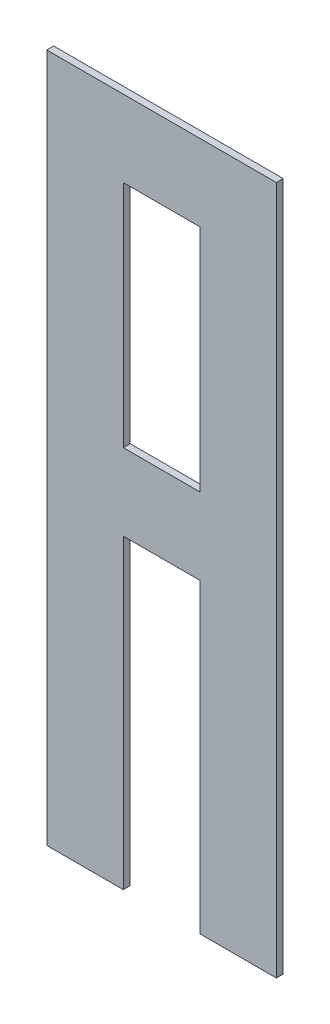
ISO-10303-21;
HEADER;
FILE_DESCRIPTION(('STEP AP214'),'2;1');
FILE_NAME('part.step','',(''),(''),'','','');
FILE_SCHEMA(('AUTOMOTIVE_DESIGN { 1 0 10303 214 1 1 1 1 }'));
ENDSEC;
DATA;
#1=APPLICATION_CONTEXT('core data for automotive mechanical design processes');
#2=APPLICATION_PROTOCOL_DEFINITION('international standard','automotive_design',2000,#1);
#3=PRODUCT_CONTEXT('',#1,'mechanical');
#4=PRODUCT('Part','Part','',(#3));
#5=PRODUCT_RELATED_PRODUCT_CATEGORY('part','',(#4));
#6=PRODUCT_DEFINITION_FORMATION('','',#4);
#7=PRODUCT_DEFINITION_CONTEXT('part definition',#1,'design');
#8=PRODUCT_DEFINITION('design','',#6,#7);
#9=PRODUCT_DEFINITION_SHAPE('','',#8);
#10=(LENGTH_UNIT() NAMED_UNIT(*) SI_UNIT(.MILLI.,.METRE.));
#11=(NAMED_UNIT(*) PLANE_ANGLE_UNIT() SI_UNIT($,.RADIAN.));
#12=(NAMED_UNIT(*) SI_UNIT($,.STERADIAN.) SOLID_ANGLE_UNIT());
#13=UNCERTAINTY_MEASURE_WITH_UNIT(LENGTH_MEASURE(1.E-05),#10,'distance_accuracy_value','');
#14=(GEOMETRIC_REPRESENTATION_CONTEXT(3) GLOBAL_UNCERTAINTY_ASSIGNED_CONTEXT((#13)) GLOBAL_UNIT_ASSIGNED_CONTEXT((#10,
#11,#12)) REPRESENTATION_CONTEXT('',''));
#15=CARTESIAN_POINT('',(0.,0.,0.));
#16=DIRECTION('',(0.,0.,1.));
#17=DIRECTION('',(1.,0.,0.));
#18=AXIS2_PLACEMENT_3D('',#15,#16,#17);
#19=CARTESIAN_POINT('',(0.,0.,0.05));
#20=DIRECTION('',(0.,0.,1.));
#21=DIRECTION('',(1.,0.,0.));
#22=AXIS2_PLACEMENT_3D('',#19,#20,#21);
#23=PLANE('',#22);
#24=DIRECTION('',(1.,0.,0.));
#25=VECTOR('',#24,1.);
#26=CARTESIAN_POINT('',(0.,1.944,0.05));
#27=LINE('',#26,#25);
#28=CARTESIAN_POINT('',(-0.278,1.944,0.05));
#29=VERTEX_POINT('',#28);
#30=CARTESIAN_POINT('',(0.278,1.944,0.05));
#31=VERTEX_POINT('',#30);
#32=EDGE_CURVE('E20',#29,#31,#27,.T.);
#33=ORIENTED_EDGE('',*,*,#32,.T.);
#34=DIRECTION('',(0.,1.,0.));
#35=VECTOR('',#34,1.);
#36=CARTESIAN_POINT('',(0.278,1.944,0.05));
#37=LINE('',#36,#35);
#38=CARTESIAN_POINT('',(0.278,0.278,0.05));
#39=VERTEX_POINT('',#38);
#40=EDGE_CURVE('E152',#39,#31,#37,.T.);
#41=ORIENTED_EDGE('',*,*,#40,.F.);
#42=DIRECTION('',(1.,0.,0.));
#43=VECTOR('',#42,1.);
#44=CARTESIAN_POINT('',(0.278,0.278,0.05));
#45=LINE('',#44,#43);
#46=CARTESIAN_POINT('',(-0.278,0.278,0.05));
#47=VERTEX_POINT('',#46);
#48=EDGE_CURVE('E155',#47,#39,#45,.T.);
#49=ORIENTED_EDGE('',*,*,#48,.F.);
#50=DIRECTION('',(0.,1.,0.));
#51=VECTOR('',#50,1.);
#52=CARTESIAN_POINT('',(-0.278,0.278,0.05));
#53=LINE('',#52,#51);
#54=EDGE_CURVE('E159',#29,#47,#53,.F.);
#55=ORIENTED_EDGE('',*,*,#54,.F.);
#56=EDGE_LOOP('',(#33,#41,#49,#55));
#57=FACE_BOUND('',#56,.T.);
#58=DIRECTION('',(0.,1.,0.));
#59=VECTOR('',#58,1.);
#60=CARTESIAN_POINT('',(-0.833,2.5,0.05));
#61=LINE('',#60,#59);
#62=CARTESIAN_POINT('',(-0.833,-2.5,0.05));
#63=VERTEX_POINT('',#62);
#64=CARTESIAN_POINT('',(-0.833,2.5,0.05));
#65=VERTEX_POINT('',#64);
#66=EDGE_CURVE('E120',#63,#65,#61,.T.);
#67=ORIENTED_EDGE('',*,*,#66,.F.);
#68=DIRECTION('',(1.,0.,0.));
#69=VECTOR('',#68,1.);
#70=CARTESIAN_POINT('',(-0.833,-2.5,0.05));
#71=LINE('',#70,#69);
#72=CARTESIAN_POINT('',(-0.278,-2.5,0.05));
#73=VERTEX_POINT('',#72);
#74=EDGE_CURVE('E116',#73,#63,#71,.F.);
#75=ORIENTED_EDGE('',*,*,#74,.F.);
#76=DIRECTION('',(0.,1.,0.));
#77=VECTOR('',#76,1.);
#78=CARTESIAN_POINT('',(-0.278,-2.5,0.05));
#79=LINE('',#78,#77);
#80=CARTESIAN_POINT('',(-0.278,-0.278,0.05));
#81=VERTEX_POINT('',#80);
#82=EDGE_CURVE('E107',#81,#73,#79,.F.);
#83=ORIENTED_EDGE('',*,*,#82,.F.);
#84=DIRECTION('',(1.,0.,0.));
#85=VECTOR('',#84,1.);
#86=CARTESIAN_POINT('',(-0.278,-0.278,0.05));
#87=LINE('',#86,#85);
#88=CARTESIAN_POINT('',(0.278,-0.278,0.05));
#89=VERTEX_POINT('',#88);
#90=EDGE_CURVE('E102',#89,#81,#87,.F.);
#91=ORIENTED_EDGE('',*,*,#90,.F.);
#92=DIRECTION('',(0.,1.,0.));
#93=VECTOR('',#92,1.);
#94=CARTESIAN_POINT('',(0.278,-0.278,0.05));
#95=LINE('',#94,#93);
#96=CARTESIAN_POINT('',(0.278,-2.5,0.05));
#97=VERTEX_POINT('',#96);
#98=EDGE_CURVE('E131',#97,#89,#95,.T.);
#99=ORIENTED_EDGE('',*,*,#98,.F.);
#100=DIRECTION('',(1.,0.,0.));
#101=VECTOR('',#100,1.);
#102=CARTESIAN_POINT('',(0.278,-2.5,0.05));
#103=LINE('',#102,#101);
#104=CARTESIAN_POINT('',(0.833,-2.5,0.05));
#105=VERTEX_POINT('',#104);
#106=EDGE_CURVE('E135',#105,#97,#103,.F.);
#107=ORIENTED_EDGE('',*,*,#106,.F.);
#108=DIRECTION('',(0.,1.,0.));
#109=VECTOR('',#108,1.);
#110=CARTESIAN_POINT('',(0.833,-2.5,0.05));
#111=LINE('',#110,#109);
#112=CARTESIAN_POINT('',(0.833,2.5,0.05));
#113=VERTEX_POINT('',#112);
#114=EDGE_CURVE('E139',#113,#105,#111,.F.);
#115=ORIENTED_EDGE('',*,*,#114,.F.);
#116=DIRECTION('',(1.,0.,0.));
#117=VECTOR('',#116,1.);
#118=CARTESIAN_POINT('',(0.833,2.5,0.05));
#119=LINE('',#118,#117);
#120=EDGE_CURVE('E143',#65,#113,#119,.T.);
#121=ORIENTED_EDGE('',*,*,#120,.F.);
#122=EDGE_LOOP('',(#67,#75,#83,#91,#99,#107,#115,#121));
#123=FACE_BOUND('',#122,.T.);
#124=ADVANCED_FACE('F17',(#57,#123),#23,.T.);
#125=CARTESIAN_POINT('',(-0.833,-2.5,0.));
#126=DIRECTION('',(0.,-1.,0.));
#127=DIRECTION('',(0.,0.,-1.));
#128=AXIS2_PLACEMENT_3D('',#125,#126,#127);
#129=PLANE('',#128);
#130=DIRECTION('',(0.,0.,1.));
#131=VECTOR('',#130,1.);
#132=CARTESIAN_POINT('',(-0.833,-2.5,0.));
#133=LINE('',#132,#131);
#134=CARTESIAN_POINT('',(-0.833,-2.5,0.));
#135=VERTEX_POINT('',#134);
#136=EDGE_CURVE('E147',#135,#63,#133,.T.);
#137=ORIENTED_EDGE('',*,*,#136,.F.);
#138=DIRECTION('',(1.,0.,0.));
#139=VECTOR('',#138,1.);
#140=CARTESIAN_POINT('',(0.,-2.5,0.));
#141=LINE('',#140,#139);
#142=CARTESIAN_POINT('',(-0.278,-2.5,0.));
#143=VERTEX_POINT('',#142);
#144=EDGE_CURVE('E126',#135,#143,#141,.T.);
#145=ORIENTED_EDGE('',*,*,#144,.T.);
#146=DIRECTION('',(0.,0.,-1.));
#147=VECTOR('',#146,1.);
#148=CARTESIAN_POINT('',(-0.278,-2.5,0.));
#149=LINE('',#148,#147);
#150=EDGE_CURVE('E112',#73,#143,#149,.T.);
#151=ORIENTED_EDGE('',*,*,#150,.F.);
#152=ORIENTED_EDGE('',*,*,#74,.T.);
#153=EDGE_LOOP('',(#137,#145,#151,#152));
#154=FACE_BOUND('',#153,.T.);
#155=ADVANCED_FACE('F125',(#154),#129,.T.);
#156=CARTESIAN_POINT('',(-0.278,-2.5,0.));
#157=DIRECTION('',(1.,0.,0.));
#158=DIRECTION('',(0.,0.,-1.));
#159=AXIS2_PLACEMENT_3D('',#156,#157,#158);
#160=PLANE('',#159);
#161=ORIENTED_EDGE('',*,*,#150,.T.);
#162=DIRECTION('',(0.,1.,0.));
#163=VECTOR('',#162,1.);
#164=CARTESIAN_POINT('',(-0.278,0.,0.));
#165=LINE('',#164,#163);
#166=CARTESIAN_POINT('',(-0.278,-0.278,0.));
#167=VERTEX_POINT('',#166);
#168=EDGE_CURVE('E168',#143,#167,#165,.T.);
#169=ORIENTED_EDGE('',*,*,#168,.T.);
#170=DIRECTION('',(0.,0.,-1.));
#171=VECTOR('',#170,1.);
#172=CARTESIAN_POINT('',(-0.278,-0.278,0.));
#173=LINE('',#172,#171);
#174=EDGE_CURVE('E114',#81,#167,#173,.T.);
#175=ORIENTED_EDGE('',*,*,#174,.F.);
#176=ORIENTED_EDGE('',*,*,#82,.T.);
#177=EDGE_LOOP('',(#161,#169,#175,#176));
#178=FACE_BOUND('',#177,.T.);
#179=ADVANCED_FACE('F109',(#178),#160,.T.);
#180=CARTESIAN_POINT('',(-0.278,-0.278,0.));
#181=DIRECTION('',(0.,-1.,0.));
#182=DIRECTION('',(0.,0.,-1.));
#183=AXIS2_PLACEMENT_3D('',#180,#181,#182);
#184=PLANE('',#183);
#185=ORIENTED_EDGE('',*,*,#174,.T.);
#186=DIRECTION('',(1.,0.,0.));
#187=VECTOR('',#186,1.);
#188=CARTESIAN_POINT('',(0.,-0.278,0.));
#189=LINE('',#188,#187);
#190=CARTESIAN_POINT('',(0.278,-0.278,0.));
#191=VERTEX_POINT('',#190);
#192=EDGE_CURVE('E170',#167,#191,#189,.T.);
#193=ORIENTED_EDGE('',*,*,#192,.T.);
#194=DIRECTION('',(0.,0.,1.));
#195=VECTOR('',#194,1.);
#196=CARTESIAN_POINT('',(0.278,-0.278,0.));
#197=LINE('',#196,#195);
#198=EDGE_CURVE('E133',#89,#191,#197,.F.);
#199=ORIENTED_EDGE('',*,*,#198,.F.);
#200=ORIENTED_EDGE('',*,*,#90,.T.);
#201=EDGE_LOOP('',(#185,#193,#199,#200));
#202=FACE_BOUND('',#201,.T.);
#203=ADVANCED_FACE('F245',(#202),#184,.T.);
#204=CARTESIAN_POINT('',(0.278,-0.278,0.));
#205=DIRECTION('',(-1.,0.,0.));
#206=DIRECTION('',(0.,0.,1.));
#207=AXIS2_PLACEMENT_3D('',#204,#205,#206);
#208=PLANE('',#207);
#209=ORIENTED_EDGE('',*,*,#198,.T.);
#210=DIRECTION('',(0.,1.,0.));
#211=VECTOR('',#210,1.);
#212=CARTESIAN_POINT('',(0.278,0.,0.));
#213=LINE('',#212,#211);
#214=CARTESIAN_POINT('',(0.278,-2.5,0.));
#215=VERTEX_POINT('',#214);
#216=EDGE_CURVE('E173',#191,#215,#213,.F.);
#217=ORIENTED_EDGE('',*,*,#216,.T.);
#218=DIRECTION('',(0.,0.,-1.));
#219=VECTOR('',#218,1.);
#220=CARTESIAN_POINT('',(0.278,-2.5,0.));
#221=LINE('',#220,#219);
#222=EDGE_CURVE('E137',#97,#215,#221,.T.);
#223=ORIENTED_EDGE('',*,*,#222,.F.);
#224=ORIENTED_EDGE('',*,*,#98,.T.);
#225=EDGE_LOOP('',(#209,#217,#223,#224));
#226=FACE_BOUND('',#225,.T.);
#227=ADVANCED_FACE('F241',(#226),#208,.T.);
#228=CARTESIAN_POINT('',(0.278,-2.5,0.));
#229=DIRECTION('',(0.,-1.,0.));
#230=DIRECTION('',(0.,0.,-1.));
#231=AXIS2_PLACEMENT_3D('',#228,#229,#230);
#232=PLANE('',#231);
#233=ORIENTED_EDGE('',*,*,#222,.T.);
#234=DIRECTION('',(1.,0.,0.));
#235=VECTOR('',#234,1.);
#236=CARTESIAN_POINT('',(0.,-2.5,0.));
#237=LINE('',#236,#235);
#238=CARTESIAN_POINT('',(0.833,-2.5,0.));
#239=VERTEX_POINT('',#238);
#240=EDGE_CURVE('E176',#215,#239,#237,.T.);
#241=ORIENTED_EDGE('',*,*,#240,.T.);
#242=DIRECTION('',(0.,0.,-1.));
#243=VECTOR('',#242,1.);
#244=CARTESIAN_POINT('',(0.833,-2.5,0.));
#245=LINE('',#244,#243);
#246=EDGE_CURVE('E141',#105,#239,#245,.T.);
#247=ORIENTED_EDGE('',*,*,#246,.F.);
#248=ORIENTED_EDGE('',*,*,#106,.T.);
#249=EDGE_LOOP('',(#233,#241,#247,#248));
#250=FACE_BOUND('',#249,.T.);
#251=ADVANCED_FACE('F237',(#250),#232,.T.);
#252=CARTESIAN_POINT('',(0.833,-2.5,0.));
#253=DIRECTION('',(1.,0.,0.));
#254=DIRECTION('',(0.,0.,-1.));
#255=AXIS2_PLACEMENT_3D('',#252,#253,#254);
#256=PLANE('',#255);
#257=ORIENTED_EDGE('',*,*,#246,.T.);
#258=DIRECTION('',(0.,1.,0.));
#259=VECTOR('',#258,1.);
#260=CARTESIAN_POINT('',(0.833,0.,0.));
#261=LINE('',#260,#259);
#262=CARTESIAN_POINT('',(0.833,2.5,0.));
#263=VERTEX_POINT('',#262);
#264=EDGE_CURVE('E179',#239,#263,#261,.T.);
#265=ORIENTED_EDGE('',*,*,#264,.T.);
#266=DIRECTION('',(0.,0.,1.));
#267=VECTOR('',#266,1.);
#268=CARTESIAN_POINT('',(0.833,2.5,0.));
#269=LINE('',#268,#267);
#270=EDGE_CURVE('E145',#113,#263,#269,.F.);
#271=ORIENTED_EDGE('',*,*,#270,.F.);
#272=ORIENTED_EDGE('',*,*,#114,.T.);
#273=EDGE_LOOP('',(#257,#265,#271,#272));
#274=FACE_BOUND('',#273,.T.);
#275=ADVANCED_FACE('F233',(#274),#256,.T.);
#276=CARTESIAN_POINT('',(0.833,2.5,0.));
#277=DIRECTION('',(0.,1.,0.));
#278=DIRECTION('',(0.,0.,1.));
#279=AXIS2_PLACEMENT_3D('',#276,#277,#278);
#280=PLANE('',#279);
#281=ORIENTED_EDGE('',*,*,#270,.T.);
#282=DIRECTION('',(1.,0.,0.));
#283=VECTOR('',#282,1.);
#284=CARTESIAN_POINT('',(0.,2.5,0.));
#285=LINE('',#284,#283);
#286=CARTESIAN_POINT('',(-0.833,2.5,0.));
#287=VERTEX_POINT('',#286);
#288=EDGE_CURVE('E182',#263,#287,#285,.F.);
#289=ORIENTED_EDGE('',*,*,#288,.T.);
#290=DIRECTION('',(0.,0.,1.));
#291=VECTOR('',#290,1.);
#292=CARTESIAN_POINT('',(-0.833,2.5,0.));
#293=LINE('',#292,#291);
#294=EDGE_CURVE('E150',#65,#287,#293,.F.);
#295=ORIENTED_EDGE('',*,*,#294,.F.);
#296=ORIENTED_EDGE('',*,*,#120,.T.);
#297=EDGE_LOOP('',(#281,#289,#295,#296));
#298=FACE_BOUND('',#297,.T.);
#299=ADVANCED_FACE('F229',(#298),#280,.T.);
#300=CARTESIAN_POINT('',(-0.833,2.5,0.));
#301=DIRECTION('',(-1.,0.,0.));
#302=DIRECTION('',(0.,0.,1.));
#303=AXIS2_PLACEMENT_3D('',#300,#301,#302);
#304=PLANE('',#303);
#305=ORIENTED_EDGE('',*,*,#294,.T.);
#306=DIRECTION('',(0.,1.,0.));
#307=VECTOR('',#306,1.);
#308=CARTESIAN_POINT('',(-0.833,0.,0.));
#309=LINE('',#308,#307);
#310=EDGE_CURVE('E185',#287,#135,#309,.F.);
#311=ORIENTED_EDGE('',*,*,#310,.T.);
#312=ORIENTED_EDGE('',*,*,#136,.T.);
#313=ORIENTED_EDGE('',*,*,#66,.T.);
#314=EDGE_LOOP('',(#305,#311,#312,#313));
#315=FACE_BOUND('',#314,.T.);
#316=ADVANCED_FACE('F226',(#315),#304,.T.);
#317=CARTESIAN_POINT('',(0.278,1.944,0.));
#318=DIRECTION('',(-1.,0.,0.));
#319=DIRECTION('',(0.,0.,1.));
#320=AXIS2_PLACEMENT_3D('',#317,#318,#319);
#321=PLANE('',#320);
#322=DIRECTION('',(0.,0.,-1.));
#323=VECTOR('',#322,1.);
#324=CARTESIAN_POINT('',(0.278,1.944,0.));
#325=LINE('',#324,#323);
#326=CARTESIAN_POINT('',(0.278,1.944,0.));
#327=VERTEX_POINT('',#326);
#328=EDGE_CURVE('E163',#327,#31,#325,.F.);
#329=ORIENTED_EDGE('',*,*,#328,.F.);
#330=DIRECTION('',(0.,1.,0.));
#331=VECTOR('',#330,1.);
#332=CARTESIAN_POINT('',(0.278,0.,0.));
#333=LINE('',#332,#331);
#334=CARTESIAN_POINT('',(0.278,0.278,0.));
#335=VERTEX_POINT('',#334);
#336=EDGE_CURVE('E188',#327,#335,#333,.F.);
#337=ORIENTED_EDGE('',*,*,#336,.T.);
#338=DIRECTION('',(0.,0.,1.));
#339=VECTOR('',#338,1.);
#340=CARTESIAN_POINT('',(0.278,0.278,0.));
#341=LINE('',#340,#339);
#342=EDGE_CURVE('E157',#39,#335,#341,.F.);
#343=ORIENTED_EDGE('',*,*,#342,.F.);
#344=ORIENTED_EDGE('',*,*,#40,.T.);
#345=EDGE_LOOP('',(#329,#337,#343,#344));
#346=FACE_BOUND('',#345,.T.);
#347=ADVANCED_FACE('F210',(#346),#321,.T.);
#348=CARTESIAN_POINT('',(0.278,0.278,0.));
#349=DIRECTION('',(0.,1.,0.));
#350=DIRECTION('',(0.,0.,1.));
#351=AXIS2_PLACEMENT_3D('',#348,#349,#350);
#352=PLANE('',#351);
#353=ORIENTED_EDGE('',*,*,#342,.T.);
#354=DIRECTION('',(1.,0.,0.));
#355=VECTOR('',#354,1.);
#356=CARTESIAN_POINT('',(0.,0.278,0.));
#357=LINE('',#356,#355);
#358=CARTESIAN_POINT('',(-0.278,0.278,0.));
#359=VERTEX_POINT('',#358);
#360=EDGE_CURVE('E191',#335,#359,#357,.F.);
#361=ORIENTED_EDGE('',*,*,#360,.T.);
#362=DIRECTION('',(0.,0.,-1.));
#363=VECTOR('',#362,1.);
#364=CARTESIAN_POINT('',(-0.278,0.278,0.));
#365=LINE('',#364,#363);
#366=EDGE_CURVE('E161',#47,#359,#365,.T.);
#367=ORIENTED_EDGE('',*,*,#366,.F.);
#368=ORIENTED_EDGE('',*,*,#48,.T.);
#369=EDGE_LOOP('',(#353,#361,#367,#368));
#370=FACE_BOUND('',#369,.T.);
#371=ADVANCED_FACE('F204',(#370),#352,.T.);
#372=CARTESIAN_POINT('',(-0.278,0.278,0.));
#373=DIRECTION('',(1.,0.,0.));
#374=DIRECTION('',(0.,0.,-1.));
#375=AXIS2_PLACEMENT_3D('',#372,#373,#374);
#376=PLANE('',#375);
#377=ORIENTED_EDGE('',*,*,#366,.T.);
#378=DIRECTION('',(0.,1.,0.));
#379=VECTOR('',#378,1.);
#380=CARTESIAN_POINT('',(-0.278,0.,0.));
#381=LINE('',#380,#379);
#382=CARTESIAN_POINT('',(-0.278,1.944,0.));
#383=VERTEX_POINT('',#382);
#384=EDGE_CURVE('E26',#359,#383,#381,.T.);
#385=ORIENTED_EDGE('',*,*,#384,.T.);
#386=DIRECTION('',(0.,0.,-1.));
#387=VECTOR('',#386,1.);
#388=CARTESIAN_POINT('',(-0.278,1.944,0.));
#389=LINE('',#388,#387);
#390=EDGE_CURVE('E34',#29,#383,#389,.T.);
#391=ORIENTED_EDGE('',*,*,#390,.F.);
#392=ORIENTED_EDGE('',*,*,#54,.T.);
#393=EDGE_LOOP('',(#377,#385,#391,#392));
#394=FACE_BOUND('',#393,.T.);
#395=ADVANCED_FACE('F197',(#394),#376,.T.);
#396=CARTESIAN_POINT('',(-0.278,1.944,0.));
#397=DIRECTION('',(0.,-1.,0.));
#398=DIRECTION('',(0.,0.,-1.));
#399=AXIS2_PLACEMENT_3D('',#396,#397,#398);
#400=PLANE('',#399);
#401=ORIENTED_EDGE('',*,*,#390,.T.);
#402=DIRECTION('',(1.,0.,0.));
#403=VECTOR('',#402,1.);
#404=CARTESIAN_POINT('',(0.,1.944,0.));
#405=LINE('',#404,#403);
#406=EDGE_CURVE('E11',#383,#327,#405,.T.);
#407=ORIENTED_EDGE('',*,*,#406,.T.);
#408=ORIENTED_EDGE('',*,*,#328,.T.);
#409=ORIENTED_EDGE('',*,*,#32,.F.);
#410=EDGE_LOOP('',(#401,#407,#408,#409));
#411=FACE_BOUND('',#410,.T.);
#412=ADVANCED_FACE('F211',(#411),#400,.T.);
#413=CARTESIAN_POINT('',(0.,0.,0.));
#414=DIRECTION('',(0.,0.,1.));
#415=DIRECTION('',(1.,0.,0.));
#416=AXIS2_PLACEMENT_3D('',#413,#414,#415);
#417=PLANE('',#416);
#418=ORIENTED_EDGE('',*,*,#384,.F.);
#419=ORIENTED_EDGE('',*,*,#360,.F.);
#420=ORIENTED_EDGE('',*,*,#336,.F.);
#421=ORIENTED_EDGE('',*,*,#406,.F.);
#422=EDGE_LOOP('',(#418,#419,#420,#421));
#423=FACE_BOUND('',#422,.T.);
#424=ORIENTED_EDGE('',*,*,#288,.F.);
#425=ORIENTED_EDGE('',*,*,#264,.F.);
#426=ORIENTED_EDGE('',*,*,#240,.F.);
#427=ORIENTED_EDGE('',*,*,#216,.F.);
#428=ORIENTED_EDGE('',*,*,#192,.F.);
#429=ORIENTED_EDGE('',*,*,#168,.F.);
#430=ORIENTED_EDGE('',*,*,#144,.F.);
#431=ORIENTED_EDGE('',*,*,#310,.F.);
#432=EDGE_LOOP('',(#424,#425,#426,#427,#428,#429,#430,#431));
#433=FACE_BOUND('',#432,.T.);
#434=ADVANCED_FACE('F201',(#423,#433),#417,.F.);
#435=CLOSED_SHELL('',(#124,#155,#179,#203,#227,#251,#275,#299,#316,#347,#371,#395,#412,#434));
#436=MANIFOLD_SOLID_BREP('B1',#435);
#437=ADVANCED_BREP_SHAPE_REPRESENTATION('',(#18,#436),#14);
#438=SHAPE_DEFINITION_REPRESENTATION(#9,#437);
ENDSEC;
END-ISO-10303-21;
